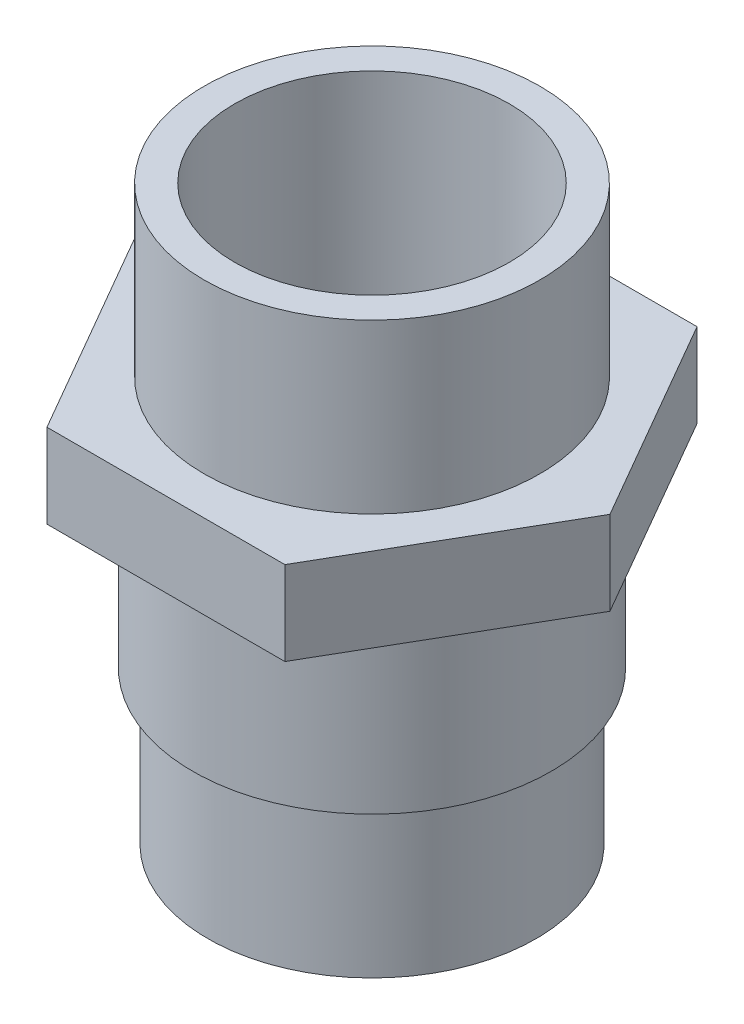
ISO-10303-21;
HEADER;
FILE_DESCRIPTION(('STEP AP214'),'2;1');
FILE_NAME('part.step','',(''),(''),'','','');
FILE_SCHEMA(('AUTOMOTIVE_DESIGN { 1 0 10303 214 1 1 1 1 }'));
ENDSEC;
DATA;
#1=APPLICATION_CONTEXT('core data for automotive mechanical design processes');
#2=APPLICATION_PROTOCOL_DEFINITION('international standard','automotive_design',2000,#1);
#3=PRODUCT_CONTEXT('',#1,'mechanical');
#4=PRODUCT('Part','Part','',(#3));
#5=PRODUCT_RELATED_PRODUCT_CATEGORY('part','',(#4));
#6=PRODUCT_DEFINITION_FORMATION('','',#4);
#7=PRODUCT_DEFINITION_CONTEXT('part definition',#1,'design');
#8=PRODUCT_DEFINITION('design','',#6,#7);
#9=PRODUCT_DEFINITION_SHAPE('','',#8);
#10=(LENGTH_UNIT() NAMED_UNIT(*) SI_UNIT(.MILLI.,.METRE.));
#11=(NAMED_UNIT(*) PLANE_ANGLE_UNIT() SI_UNIT($,.RADIAN.));
#12=(NAMED_UNIT(*) SI_UNIT($,.STERADIAN.) SOLID_ANGLE_UNIT());
#13=UNCERTAINTY_MEASURE_WITH_UNIT(LENGTH_MEASURE(1.E-05),#10,'distance_accuracy_value','');
#14=(GEOMETRIC_REPRESENTATION_CONTEXT(3) GLOBAL_UNCERTAINTY_ASSIGNED_CONTEXT((#13)) GLOBAL_UNIT_ASSIGNED_CONTEXT((#10,
#11,#12)) REPRESENTATION_CONTEXT('',''));
#15=CARTESIAN_POINT('',(0.,0.,0.));
#16=DIRECTION('',(0.,0.,1.));
#17=DIRECTION('',(1.,0.,0.));
#18=AXIS2_PLACEMENT_3D('',#15,#16,#17);
#19=CARTESIAN_POINT('',(0.,-5.5,0.));
#20=DIRECTION('',(0.,-1.,0.));
#21=DIRECTION('',(0.,0.,-1.));
#22=AXIS2_PLACEMENT_3D('',#19,#20,#21);
#23=PLANE('',#22);
#24=DIRECTION('',(0.5,0.,0.866025403784439));
#25=VECTOR('',#24,1.);
#26=CARTESIAN_POINT('',(7.79422863405995,-5.5,-13.5));
#27=LINE('',#26,#25);
#28=CARTESIAN_POINT('',(7.79422863405995,-5.5,-13.5));
#29=VERTEX_POINT('',#28);
#30=CARTESIAN_POINT('',(15.5884572681199,-5.5,0.));
#31=VERTEX_POINT('',#30);
#32=EDGE_CURVE('E129',#29,#31,#27,.T.);
#33=ORIENTED_EDGE('',*,*,#32,.T.);
#34=DIRECTION('',(-0.5,0.,0.866025403784439));
#35=VECTOR('',#34,1.);
#36=CARTESIAN_POINT('',(15.5884572681199,-5.5,0.));
#37=LINE('',#36,#35);
#38=CARTESIAN_POINT('',(7.79422863405994,-5.5,13.5));
#39=VERTEX_POINT('',#38);
#40=EDGE_CURVE('E87',#31,#39,#37,.T.);
#41=ORIENTED_EDGE('',*,*,#40,.T.);
#42=DIRECTION('',(-1.,0.,0.));
#43=VECTOR('',#42,1.);
#44=CARTESIAN_POINT('',(7.79422863405994,-5.5,13.5));
#45=LINE('',#44,#43);
#46=CARTESIAN_POINT('',(-7.79422863405995,-5.5,13.5));
#47=VERTEX_POINT('',#46);
#48=EDGE_CURVE('E100',#39,#47,#45,.T.);
#49=ORIENTED_EDGE('',*,*,#48,.T.);
#50=DIRECTION('',(-0.5,0.,-0.866025403784439));
#51=VECTOR('',#50,1.);
#52=CARTESIAN_POINT('',(-7.79422863405995,-5.5,13.5));
#53=LINE('',#52,#51);
#54=CARTESIAN_POINT('',(-15.5884572681199,-5.5,0.));
#55=VERTEX_POINT('',#54);
#56=EDGE_CURVE('E94',#47,#55,#53,.T.);
#57=ORIENTED_EDGE('',*,*,#56,.T.);
#58=DIRECTION('',(0.5,0.,-0.866025403784439));
#59=VECTOR('',#58,1.);
#60=CARTESIAN_POINT('',(-15.5884572681199,-5.5,0.));
#61=LINE('',#60,#59);
#62=CARTESIAN_POINT('',(-7.79422863405995,-5.5,-13.5));
#63=VERTEX_POINT('',#62);
#64=EDGE_CURVE('E98',#55,#63,#61,.T.);
#65=ORIENTED_EDGE('',*,*,#64,.T.);
#66=DIRECTION('',(1.,0.,0.));
#67=VECTOR('',#66,1.);
#68=CARTESIAN_POINT('',(-7.79422863405995,-5.5,-13.5));
#69=LINE('',#68,#67);
#70=EDGE_CURVE('E49',#63,#29,#69,.T.);
#71=ORIENTED_EDGE('',*,*,#70,.T.);
#72=EDGE_LOOP('',(#33,#41,#49,#57,#65,#71));
#73=FACE_BOUND('',#72,.T.);
#74=CARTESIAN_POINT('',(0.,-5.5,0.));
#75=DIRECTION('',(0.,-1.,0.));
#76=DIRECTION('',(0.,0.,-1.));
#77=AXIS2_PLACEMENT_3D('',#74,#75,#76);
#78=CIRCLE('',#77,11.75);
#79=CARTESIAN_POINT('',(0.,-5.5,-11.75));
#80=VERTEX_POINT('',#79);
#81=EDGE_CURVE('E224',#80,#80,#78,.T.);
#82=ORIENTED_EDGE('',*,*,#81,.F.);
#83=EDGE_LOOP('',(#82));
#84=FACE_BOUND('',#83,.T.);
#85=ADVANCED_FACE('F32',(#73,#84),#23,.T.);
#86=CARTESIAN_POINT('',(0.,11.,0.));
#87=DIRECTION('',(0.,1.,0.));
#88=DIRECTION('',(0.,0.,1.));
#89=AXIS2_PLACEMENT_3D('',#86,#87,#88);
#90=PLANE('',#89);
#91=CARTESIAN_POINT('',(0.,11.,0.));
#92=DIRECTION('',(0.,1.,0.));
#93=DIRECTION('',(0.,0.,1.));
#94=AXIS2_PLACEMENT_3D('',#91,#92,#93);
#95=CIRCLE('',#94,11.);
#96=CARTESIAN_POINT('',(0.,11.,11.));
#97=VERTEX_POINT('',#96);
#98=EDGE_CURVE('E11',#97,#97,#95,.T.);
#99=ORIENTED_EDGE('',*,*,#98,.T.);
#100=EDGE_LOOP('',(#99));
#101=FACE_BOUND('',#100,.T.);
#102=CARTESIAN_POINT('',(0.,11.,0.));
#103=DIRECTION('',(0.,1.,0.));
#104=DIRECTION('',(0.,0.,1.));
#105=AXIS2_PLACEMENT_3D('',#102,#103,#104);
#106=CIRCLE('',#105,9.);
#107=CARTESIAN_POINT('',(0.,11.,9.));
#108=VERTEX_POINT('',#107);
#109=EDGE_CURVE('E41',#108,#108,#106,.T.);
#110=ORIENTED_EDGE('',*,*,#109,.F.);
#111=EDGE_LOOP('',(#110));
#112=FACE_BOUND('',#111,.T.);
#113=ADVANCED_FACE('F146',(#101,#112),#90,.T.);
#114=CARTESIAN_POINT('',(0.,11.,0.));
#115=DIRECTION('',(0.,-1.,0.));
#116=DIRECTION('',(0.,0.,-1.));
#117=AXIS2_PLACEMENT_3D('',#114,#115,#116);
#118=CYLINDRICAL_SURFACE('',#117,11.);
#119=ORIENTED_EDGE('',*,*,#98,.F.);
#120=EDGE_LOOP('',(#119));
#121=FACE_BOUND('',#120,.T.);
#122=CARTESIAN_POINT('',(0.,0.,0.));
#123=DIRECTION('',(0.,-1.,0.));
#124=DIRECTION('',(0.,0.,-1.));
#125=AXIS2_PLACEMENT_3D('',#122,#123,#124);
#126=CIRCLE('',#125,11.);
#127=CARTESIAN_POINT('',(0.,0.,-11.));
#128=VERTEX_POINT('',#127);
#129=EDGE_CURVE('E138',#128,#128,#126,.T.);
#130=ORIENTED_EDGE('',*,*,#129,.F.);
#131=EDGE_LOOP('',(#130));
#132=FACE_BOUND('',#131,.T.);
#133=ADVANCED_FACE('F34',(#121,#132),#118,.T.);
#134=CARTESIAN_POINT('',(0.,11.,0.));
#135=DIRECTION('',(0.,-1.,0.));
#136=DIRECTION('',(0.,0.,-1.));
#137=AXIS2_PLACEMENT_3D('',#134,#135,#136);
#138=CYLINDRICAL_SURFACE('',#137,9.);
#139=ORIENTED_EDGE('',*,*,#109,.T.);
#140=EDGE_LOOP('',(#139));
#141=FACE_BOUND('',#140,.T.);
#142=CARTESIAN_POINT('',(0.,-16.5,0.));
#143=DIRECTION('',(0.,-1.,0.));
#144=DIRECTION('',(0.,0.,-1.));
#145=AXIS2_PLACEMENT_3D('',#142,#143,#144);
#146=CIRCLE('',#145,9.);
#147=CARTESIAN_POINT('',(0.,-16.5,-9.));
#148=VERTEX_POINT('',#147);
#149=EDGE_CURVE('E219',#148,#148,#146,.T.);
#150=ORIENTED_EDGE('',*,*,#149,.T.);
#151=EDGE_LOOP('',(#150));
#152=FACE_BOUND('',#151,.T.);
#153=ADVANCED_FACE('F143',(#141,#152),#138,.F.);
#154=CARTESIAN_POINT('',(0.,0.,0.));
#155=DIRECTION('',(0.,-1.,0.));
#156=DIRECTION('',(0.,0.,-1.));
#157=AXIS2_PLACEMENT_3D('',#154,#155,#156);
#158=PLANE('',#157);
#159=DIRECTION('',(0.5,0.,0.866025403784439));
#160=VECTOR('',#159,1.);
#161=CARTESIAN_POINT('',(7.79422863405995,0.,-13.5));
#162=LINE('',#161,#160);
#163=CARTESIAN_POINT('',(7.79422863405995,0.,-13.5));
#164=VERTEX_POINT('',#163);
#165=CARTESIAN_POINT('',(15.5884572681199,0.,0.));
#166=VERTEX_POINT('',#165);
#167=EDGE_CURVE('E118',#164,#166,#162,.T.);
#168=ORIENTED_EDGE('',*,*,#167,.F.);
#169=DIRECTION('',(1.,0.,0.));
#170=VECTOR('',#169,1.);
#171=CARTESIAN_POINT('',(-7.79422863405995,0.,-13.5));
#172=LINE('',#171,#170);
#173=CARTESIAN_POINT('',(-7.79422863405995,0.,-13.5));
#174=VERTEX_POINT('',#173);
#175=EDGE_CURVE('E78',#174,#164,#172,.T.);
#176=ORIENTED_EDGE('',*,*,#175,.F.);
#177=DIRECTION('',(0.5,0.,-0.866025403784439));
#178=VECTOR('',#177,1.);
#179=CARTESIAN_POINT('',(-15.5884572681199,0.,0.));
#180=LINE('',#179,#178);
#181=CARTESIAN_POINT('',(-15.5884572681199,0.,0.));
#182=VERTEX_POINT('',#181);
#183=EDGE_CURVE('E72',#182,#174,#180,.T.);
#184=ORIENTED_EDGE('',*,*,#183,.F.);
#185=DIRECTION('',(-0.5,0.,-0.866025403784439));
#186=VECTOR('',#185,1.);
#187=CARTESIAN_POINT('',(-7.79422863405995,0.,13.5));
#188=LINE('',#187,#186);
#189=CARTESIAN_POINT('',(-7.79422863405995,0.,13.5));
#190=VERTEX_POINT('',#189);
#191=EDGE_CURVE('E108',#190,#182,#188,.T.);
#192=ORIENTED_EDGE('',*,*,#191,.F.);
#193=DIRECTION('',(-1.,0.,0.));
#194=VECTOR('',#193,1.);
#195=CARTESIAN_POINT('',(7.79422863405994,0.,13.5));
#196=LINE('',#195,#194);
#197=CARTESIAN_POINT('',(7.79422863405994,0.,13.5));
#198=VERTEX_POINT('',#197);
#199=EDGE_CURVE('E124',#198,#190,#196,.T.);
#200=ORIENTED_EDGE('',*,*,#199,.F.);
#201=DIRECTION('',(-0.5,0.,0.866025403784439));
#202=VECTOR('',#201,1.);
#203=CARTESIAN_POINT('',(15.5884572681199,0.,0.));
#204=LINE('',#203,#202);
#205=EDGE_CURVE('E121',#166,#198,#204,.T.);
#206=ORIENTED_EDGE('',*,*,#205,.F.);
#207=EDGE_LOOP('',(#168,#176,#184,#192,#200,#206));
#208=FACE_BOUND('',#207,.T.);
#209=ORIENTED_EDGE('',*,*,#129,.T.);
#210=EDGE_LOOP('',(#209));
#211=FACE_BOUND('',#210,.T.);
#212=ADVANCED_FACE('F158',(#208,#211),#158,.F.);
#213=CARTESIAN_POINT('',(7.79422863405995,-5.5,-13.5));
#214=DIRECTION('',(-0.866025403784439,0.,0.5));
#215=DIRECTION('',(0.5,0.,0.866025403784439));
#216=AXIS2_PLACEMENT_3D('',#213,#214,#215);
#217=PLANE('',#216);
#218=ORIENTED_EDGE('',*,*,#167,.T.);
#219=DIRECTION('',(0.,1.,0.));
#220=VECTOR('',#219,1.);
#221=CARTESIAN_POINT('',(15.5884572681199,-5.5,0.));
#222=LINE('',#221,#220);
#223=EDGE_CURVE('E136',#31,#166,#222,.T.);
#224=ORIENTED_EDGE('',*,*,#223,.F.);
#225=ORIENTED_EDGE('',*,*,#32,.F.);
#226=DIRECTION('',(0.,1.,0.));
#227=VECTOR('',#226,1.);
#228=CARTESIAN_POINT('',(7.79422863405995,-5.5,-13.5));
#229=LINE('',#228,#227);
#230=EDGE_CURVE('E114',#29,#164,#229,.T.);
#231=ORIENTED_EDGE('',*,*,#230,.T.);
#232=EDGE_LOOP('',(#218,#224,#225,#231));
#233=FACE_BOUND('',#232,.T.);
#234=ADVANCED_FACE('F159',(#233),#217,.F.);
#235=CARTESIAN_POINT('',(15.5884572681199,-5.5,0.));
#236=DIRECTION('',(-0.866025403784438,0.,-0.5));
#237=DIRECTION('',(-0.5,0.,0.866025403784439));
#238=AXIS2_PLACEMENT_3D('',#235,#236,#237);
#239=PLANE('',#238);
#240=ORIENTED_EDGE('',*,*,#205,.T.);
#241=DIRECTION('',(0.,1.,0.));
#242=VECTOR('',#241,1.);
#243=CARTESIAN_POINT('',(7.79422863405994,-5.5,13.5));
#244=LINE('',#243,#242);
#245=EDGE_CURVE('E133',#39,#198,#244,.T.);
#246=ORIENTED_EDGE('',*,*,#245,.F.);
#247=ORIENTED_EDGE('',*,*,#40,.F.);
#248=ORIENTED_EDGE('',*,*,#223,.T.);
#249=EDGE_LOOP('',(#240,#246,#247,#248));
#250=FACE_BOUND('',#249,.T.);
#251=ADVANCED_FACE('F162',(#250),#239,.F.);
#252=CARTESIAN_POINT('',(7.79422863405994,-5.5,13.5));
#253=DIRECTION('',(0.,0.,-1.));
#254=DIRECTION('',(-1.,0.,0.));
#255=AXIS2_PLACEMENT_3D('',#252,#253,#254);
#256=PLANE('',#255);
#257=ORIENTED_EDGE('',*,*,#199,.T.);
#258=DIRECTION('',(0.,1.,0.));
#259=VECTOR('',#258,1.);
#260=CARTESIAN_POINT('',(-7.79422863405995,-5.5,13.5));
#261=LINE('',#260,#259);
#262=EDGE_CURVE('E109',#47,#190,#261,.T.);
#263=ORIENTED_EDGE('',*,*,#262,.F.);
#264=ORIENTED_EDGE('',*,*,#48,.F.);
#265=ORIENTED_EDGE('',*,*,#245,.T.);
#266=EDGE_LOOP('',(#257,#263,#264,#265));
#267=FACE_BOUND('',#266,.T.);
#268=ADVANCED_FACE('F166',(#267),#256,.F.);
#269=CARTESIAN_POINT('',(-7.79422863405995,-5.5,13.5));
#270=DIRECTION('',(0.866025403784439,0.,-0.5));
#271=DIRECTION('',(-0.5,0.,-0.866025403784439));
#272=AXIS2_PLACEMENT_3D('',#269,#270,#271);
#273=PLANE('',#272);
#274=ORIENTED_EDGE('',*,*,#191,.T.);
#275=DIRECTION('',(0.,1.,0.));
#276=VECTOR('',#275,1.);
#277=CARTESIAN_POINT('',(-15.5884572681199,-5.5,0.));
#278=LINE('',#277,#276);
#279=EDGE_CURVE('E105',#55,#182,#278,.T.);
#280=ORIENTED_EDGE('',*,*,#279,.F.);
#281=ORIENTED_EDGE('',*,*,#56,.F.);
#282=ORIENTED_EDGE('',*,*,#262,.T.);
#283=EDGE_LOOP('',(#274,#280,#281,#282));
#284=FACE_BOUND('',#283,.T.);
#285=ADVANCED_FACE('F106',(#284),#273,.F.);
#286=CARTESIAN_POINT('',(-15.5884572681199,-5.5,0.));
#287=DIRECTION('',(0.866025403784439,0.,0.5));
#288=DIRECTION('',(0.5,0.,-0.866025403784439));
#289=AXIS2_PLACEMENT_3D('',#286,#287,#288);
#290=PLANE('',#289);
#291=ORIENTED_EDGE('',*,*,#183,.T.);
#292=DIRECTION('',(0.,1.,0.));
#293=VECTOR('',#292,1.);
#294=CARTESIAN_POINT('',(-7.79422863405995,-5.5,-13.5));
#295=LINE('',#294,#293);
#296=EDGE_CURVE('E110',#63,#174,#295,.T.);
#297=ORIENTED_EDGE('',*,*,#296,.F.);
#298=ORIENTED_EDGE('',*,*,#64,.F.);
#299=ORIENTED_EDGE('',*,*,#279,.T.);
#300=EDGE_LOOP('',(#291,#297,#298,#299));
#301=FACE_BOUND('',#300,.T.);
#302=ADVANCED_FACE('F112',(#301),#290,.F.);
#303=CARTESIAN_POINT('',(-7.79422863405995,-5.5,-13.5));
#304=DIRECTION('',(0.,0.,1.));
#305=DIRECTION('',(1.,0.,0.));
#306=AXIS2_PLACEMENT_3D('',#303,#304,#305);
#307=PLANE('',#306);
#308=ORIENTED_EDGE('',*,*,#175,.T.);
#309=ORIENTED_EDGE('',*,*,#230,.F.);
#310=ORIENTED_EDGE('',*,*,#70,.F.);
#311=ORIENTED_EDGE('',*,*,#296,.T.);
#312=EDGE_LOOP('',(#308,#309,#310,#311));
#313=FACE_BOUND('',#312,.T.);
#314=ADVANCED_FACE('F174',(#313),#307,.F.);
#315=CARTESIAN_POINT('',(0.,-16.5,0.));
#316=DIRECTION('',(0.,-1.,0.));
#317=DIRECTION('',(0.,0.,-1.));
#318=AXIS2_PLACEMENT_3D('',#315,#316,#317);
#319=PLANE('',#318);
#320=CARTESIAN_POINT('',(0.,-16.5,0.));
#321=DIRECTION('',(0.,-1.,0.));
#322=DIRECTION('',(0.,0.,-1.));
#323=AXIS2_PLACEMENT_3D('',#320,#321,#322);
#324=CIRCLE('',#323,10.75);
#325=CARTESIAN_POINT('',(0.,-16.5,-10.75));
#326=VERTEX_POINT('',#325);
#327=EDGE_CURVE('E213',#326,#326,#324,.T.);
#328=ORIENTED_EDGE('',*,*,#327,.F.);
#329=EDGE_LOOP('',(#328));
#330=FACE_BOUND('',#329,.T.);
#331=CARTESIAN_POINT('',(0.,-16.5,0.));
#332=DIRECTION('',(0.,-1.,0.));
#333=DIRECTION('',(0.,0.,-1.));
#334=AXIS2_PLACEMENT_3D('',#331,#332,#333);
#335=CIRCLE('',#334,11.75);
#336=CARTESIAN_POINT('',(0.,-16.5,-11.75));
#337=VERTEX_POINT('',#336);
#338=EDGE_CURVE('E122',#337,#337,#335,.T.);
#339=ORIENTED_EDGE('',*,*,#338,.T.);
#340=EDGE_LOOP('',(#339));
#341=FACE_BOUND('',#340,.T.);
#342=ADVANCED_FACE('F177',(#330,#341),#319,.T.);
#343=CARTESIAN_POINT('',(0.,-16.5,0.));
#344=DIRECTION('',(0.,1.,0.));
#345=DIRECTION('',(0.,0.,1.));
#346=AXIS2_PLACEMENT_3D('',#343,#344,#345);
#347=CYLINDRICAL_SURFACE('',#346,11.75);
#348=ORIENTED_EDGE('',*,*,#338,.F.);
#349=EDGE_LOOP('',(#348));
#350=FACE_BOUND('',#349,.T.);
#351=ORIENTED_EDGE('',*,*,#81,.T.);
#352=EDGE_LOOP('',(#351));
#353=FACE_BOUND('',#352,.T.);
#354=ADVANCED_FACE('F181',(#350,#353),#347,.T.);
#355=CARTESIAN_POINT('',(0.,-16.5,0.));
#356=DIRECTION('',(0.,-1.,0.));
#357=DIRECTION('',(0.,0.,-1.));
#358=AXIS2_PLACEMENT_3D('',#355,#356,#357);
#359=PLANE('',#358);
#360=CARTESIAN_POINT('',(0.,-16.5,0.));
#361=DIRECTION('',(0.,-1.,0.));
#362=DIRECTION('',(0.,0.,-1.));
#363=AXIS2_PLACEMENT_3D('',#360,#361,#362);
#364=CIRCLE('',#363,7.);
#365=CARTESIAN_POINT('',(0.,-16.5,-7.));
#366=VERTEX_POINT('',#365);
#367=EDGE_CURVE('E211',#366,#366,#364,.T.);
#368=ORIENTED_EDGE('',*,*,#367,.T.);
#369=EDGE_LOOP('',(#368));
#370=FACE_BOUND('',#369,.T.);
#371=ORIENTED_EDGE('',*,*,#149,.F.);
#372=EDGE_LOOP('',(#371));
#373=FACE_BOUND('',#372,.T.);
#374=ADVANCED_FACE('F184',(#370,#373),#359,.F.);
#375=CARTESIAN_POINT('',(0.,-26.5,0.));
#376=DIRECTION('',(0.,-1.,0.));
#377=DIRECTION('',(0.,0.,-1.));
#378=AXIS2_PLACEMENT_3D('',#375,#376,#377);
#379=PLANE('',#378);
#380=CARTESIAN_POINT('',(0.,-26.5,0.));
#381=DIRECTION('',(0.,-1.,0.));
#382=DIRECTION('',(0.,0.,-1.));
#383=AXIS2_PLACEMENT_3D('',#380,#381,#382);
#384=CIRCLE('',#383,10.75);
#385=CARTESIAN_POINT('',(0.,-26.5,-10.75));
#386=VERTEX_POINT('',#385);
#387=EDGE_CURVE('E216',#386,#386,#384,.T.);
#388=ORIENTED_EDGE('',*,*,#387,.T.);
#389=EDGE_LOOP('',(#388));
#390=FACE_BOUND('',#389,.T.);
#391=CARTESIAN_POINT('',(0.,-26.5,0.));
#392=DIRECTION('',(0.,-1.,0.));
#393=DIRECTION('',(0.,0.,-1.));
#394=AXIS2_PLACEMENT_3D('',#391,#392,#393);
#395=CIRCLE('',#394,7.);
#396=CARTESIAN_POINT('',(0.,-26.5,-7.));
#397=VERTEX_POINT('',#396);
#398=EDGE_CURVE('E208',#397,#397,#395,.T.);
#399=ORIENTED_EDGE('',*,*,#398,.F.);
#400=EDGE_LOOP('',(#399));
#401=FACE_BOUND('',#400,.T.);
#402=ADVANCED_FACE('F193',(#390,#401),#379,.T.);
#403=CARTESIAN_POINT('',(0.,-26.5,0.));
#404=DIRECTION('',(0.,1.,0.));
#405=DIRECTION('',(0.,0.,1.));
#406=AXIS2_PLACEMENT_3D('',#403,#404,#405);
#407=CYLINDRICAL_SURFACE('',#406,10.75);
#408=ORIENTED_EDGE('',*,*,#387,.F.);
#409=EDGE_LOOP('',(#408));
#410=FACE_BOUND('',#409,.T.);
#411=ORIENTED_EDGE('',*,*,#327,.T.);
#412=EDGE_LOOP('',(#411));
#413=FACE_BOUND('',#412,.T.);
#414=ADVANCED_FACE('F189',(#410,#413),#407,.T.);
#415=CARTESIAN_POINT('',(0.,-26.5,0.));
#416=DIRECTION('',(0.,1.,0.));
#417=DIRECTION('',(0.,0.,1.));
#418=AXIS2_PLACEMENT_3D('',#415,#416,#417);
#419=CYLINDRICAL_SURFACE('',#418,7.);
#420=ORIENTED_EDGE('',*,*,#398,.T.);
#421=EDGE_LOOP('',(#420));
#422=FACE_BOUND('',#421,.T.);
#423=ORIENTED_EDGE('',*,*,#367,.F.);
#424=EDGE_LOOP('',(#423));
#425=FACE_BOUND('',#424,.T.);
#426=ADVANCED_FACE('F192',(#422,#425),#419,.F.);
#427=CLOSED_SHELL('',(#85,#113,#133,#153,#212,#234,#251,#268,#285,#302,#314,#342,#354,#374,#402,
#414,#426));
#428=MANIFOLD_SOLID_BREP('B2',#427);
#429=ADVANCED_BREP_SHAPE_REPRESENTATION('',(#18,#428),#14);
#430=SHAPE_DEFINITION_REPRESENTATION(#9,#429);
ENDSEC;
END-ISO-10303-21;
